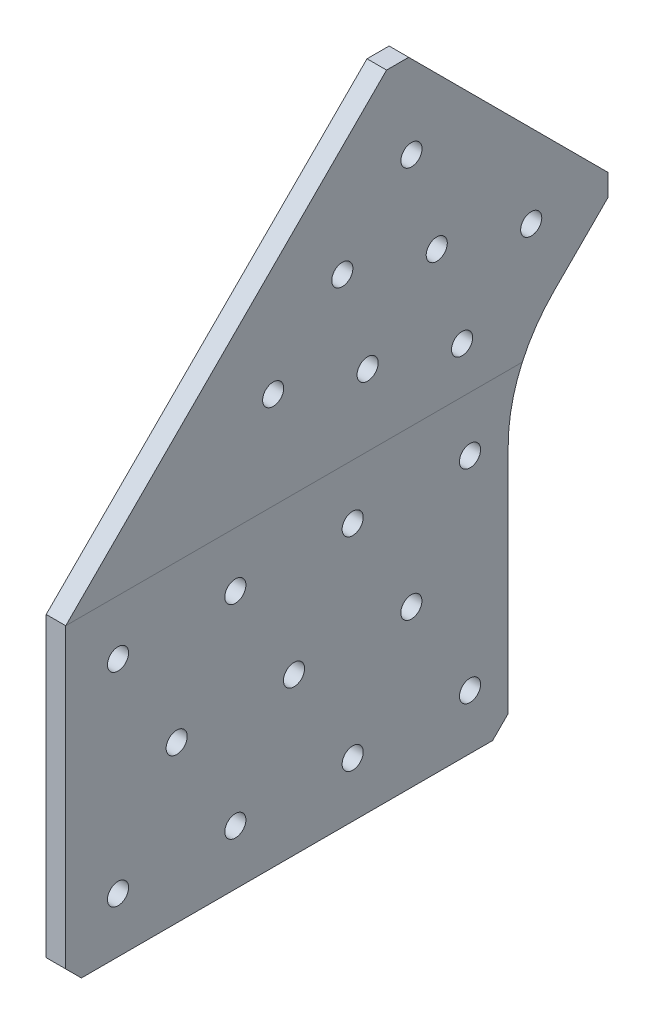
ISO-10303-21;
HEADER;
FILE_DESCRIPTION(('STEP AP214'),'2;1');
FILE_NAME('part.step','',(''),(''),'','','');
FILE_SCHEMA(('AUTOMOTIVE_DESIGN { 1 0 10303 214 1 1 1 1 }'));
ENDSEC;
DATA;
#1=APPLICATION_CONTEXT('core data for automotive mechanical design processes');
#2=APPLICATION_PROTOCOL_DEFINITION('international standard','automotive_design',2000,#1);
#3=PRODUCT_CONTEXT('',#1,'mechanical');
#4=PRODUCT('Part','Part','',(#3));
#5=PRODUCT_RELATED_PRODUCT_CATEGORY('part','',(#4));
#6=PRODUCT_DEFINITION_FORMATION('','',#4);
#7=PRODUCT_DEFINITION_CONTEXT('part definition',#1,'design');
#8=PRODUCT_DEFINITION('design','',#6,#7);
#9=PRODUCT_DEFINITION_SHAPE('','',#8);
#10=(LENGTH_UNIT() NAMED_UNIT(*) SI_UNIT(.MILLI.,.METRE.));
#11=(NAMED_UNIT(*) PLANE_ANGLE_UNIT() SI_UNIT($,.RADIAN.));
#12=(NAMED_UNIT(*) SI_UNIT($,.STERADIAN.) SOLID_ANGLE_UNIT());
#13=UNCERTAINTY_MEASURE_WITH_UNIT(LENGTH_MEASURE(1.E-05),#10,'distance_accuracy_value','');
#14=(GEOMETRIC_REPRESENTATION_CONTEXT(3) GLOBAL_UNCERTAINTY_ASSIGNED_CONTEXT((#13)) GLOBAL_UNIT_ASSIGNED_CONTEXT((#10,
#11,#12)) REPRESENTATION_CONTEXT('',''));
#15=CARTESIAN_POINT('',(0.,0.,0.));
#16=DIRECTION('',(0.,0.,1.));
#17=DIRECTION('',(1.,0.,0.));
#18=AXIS2_PLACEMENT_3D('',#15,#16,#17);
#19=CARTESIAN_POINT('',(3.175,40.2789755157233,-25.4));
#20=DIRECTION('',(1.,0.,0.));
#21=DIRECTION('',(0.,0.,-1.));
#22=AXIS2_PLACEMENT_3D('',#19,#20,#21);
#23=PLANE('',#22);
#24=CARTESIAN_POINT('',(3.175,41.8977839420936,6.20530694255749));
#25=DIRECTION('',(1.,0.,0.));
#26=DIRECTION('',(0.,1.,0.));
#27=AXIS2_PLACEMENT_3D('',#24,#25,#26);
#28=CIRCLE('',#27,1.7145);
#29=CARTESIAN_POINT('',(3.175,43.6122839420936,6.20530694255749));
#30=VERTEX_POINT('',#29);
#31=EDGE_CURVE('E404',#30,#30,#28,.T.);
#32=ORIENTED_EDGE('',*,*,#31,.F.);
#33=EDGE_LOOP('',(#32));
#34=FACE_BOUND('',#33,.T.);
#35=CARTESIAN_POINT('',(3.175,41.8977839420936,25.2553069425574));
#36=DIRECTION('',(1.,0.,0.));
#37=DIRECTION('',(0.,1.,0.));
#38=AXIS2_PLACEMENT_3D('',#35,#36,#37);
#39=CIRCLE('',#38,1.7145);
#40=CARTESIAN_POINT('',(3.175,43.6122839420936,25.2553069425574));
#41=VERTEX_POINT('',#40);
#42=EDGE_CURVE('E412',#41,#41,#39,.T.);
#43=ORIENTED_EDGE('',*,*,#42,.F.);
#44=EDGE_LOOP('',(#43));
#45=FACE_BOUND('',#44,.T.);
#46=CARTESIAN_POINT('',(3.175,41.8977839420936,44.3053069425573));
#47=DIRECTION('',(1.,0.,0.));
#48=DIRECTION('',(0.,1.,0.));
#49=AXIS2_PLACEMENT_3D('',#46,#47,#48);
#50=CIRCLE('',#49,1.7145);
#51=CARTESIAN_POINT('',(3.175,43.6122839420936,44.3053069425573));
#52=VERTEX_POINT('',#51);
#53=EDGE_CURVE('E420',#52,#52,#50,.T.);
#54=ORIENTED_EDGE('',*,*,#53,.F.);
#55=EDGE_LOOP('',(#54));
#56=FACE_BOUND('',#55,.T.);
#57=CARTESIAN_POINT('',(3.175,41.8977839420936,63.3553069425573));
#58=DIRECTION('',(1.,0.,0.));
#59=DIRECTION('',(0.,1.,0.));
#60=AXIS2_PLACEMENT_3D('',#57,#58,#59);
#61=CIRCLE('',#60,1.7145);
#62=CARTESIAN_POINT('',(3.175,43.6122839420936,63.3553069425573));
#63=VERTEX_POINT('',#62);
#64=EDGE_CURVE('E428',#63,#63,#61,.T.);
#65=ORIENTED_EDGE('',*,*,#64,.F.);
#66=EDGE_LOOP('',(#65));
#67=FACE_BOUND('',#66,.T.);
#68=CARTESIAN_POINT('',(3.175,8.90221605790642,25.2553069425574));
#69=DIRECTION('',(1.,0.,0.));
#70=DIRECTION('',(0.,1.,0.));
#71=AXIS2_PLACEMENT_3D('',#68,#69,#70);
#72=CIRCLE('',#71,1.7145);
#73=CARTESIAN_POINT('',(3.175,10.6167160579064,25.2553069425574));
#74=VERTEX_POINT('',#73);
#75=EDGE_CURVE('E385',#74,#74,#72,.T.);
#76=ORIENTED_EDGE('',*,*,#75,.F.);
#77=EDGE_LOOP('',(#76));
#78=FACE_BOUND('',#77,.T.);
#79=CARTESIAN_POINT('',(3.175,25.4,53.8303069425573));
#80=DIRECTION('',(1.,0.,0.));
#81=DIRECTION('',(0.,1.,0.));
#82=AXIS2_PLACEMENT_3D('',#79,#80,#81);
#83=CIRCLE('',#82,1.7145);
#84=CARTESIAN_POINT('',(3.175,27.1145,53.8303069425573));
#85=VERTEX_POINT('',#84);
#86=EDGE_CURVE('E438',#85,#85,#83,.T.);
#87=ORIENTED_EDGE('',*,*,#86,.F.);
#88=EDGE_LOOP('',(#87));
#89=FACE_BOUND('',#88,.T.);
#90=CARTESIAN_POINT('',(3.175,25.4,34.7803069425574));
#91=DIRECTION('',(1.,0.,0.));
#92=DIRECTION('',(0.,1.,0.));
#93=AXIS2_PLACEMENT_3D('',#90,#91,#92);
#94=CIRCLE('',#93,1.7145);
#95=CARTESIAN_POINT('',(3.175,27.1145,34.7803069425574));
#96=VERTEX_POINT('',#95);
#97=EDGE_CURVE('E437',#96,#96,#94,.T.);
#98=ORIENTED_EDGE('',*,*,#97,.F.);
#99=EDGE_LOOP('',(#98));
#100=FACE_BOUND('',#99,.T.);
#101=CARTESIAN_POINT('',(3.175,25.4,15.7303069425575));
#102=DIRECTION('',(1.,0.,0.));
#103=DIRECTION('',(0.,1.,0.));
#104=AXIS2_PLACEMENT_3D('',#101,#102,#103);
#105=CIRCLE('',#104,1.7145);
#106=CARTESIAN_POINT('',(3.175,27.1145,15.7303069425575));
#107=VERTEX_POINT('',#106);
#108=EDGE_CURVE('E452',#107,#107,#105,.T.);
#109=ORIENTED_EDGE('',*,*,#108,.F.);
#110=EDGE_LOOP('',(#109));
#111=FACE_BOUND('',#110,.T.);
#112=CARTESIAN_POINT('',(3.175,8.90221605790642,44.3053069425573));
#113=DIRECTION('',(1.,0.,0.));
#114=DIRECTION('',(0.,1.,0.));
#115=AXIS2_PLACEMENT_3D('',#112,#113,#114);
#116=CIRCLE('',#115,1.7145);
#117=CARTESIAN_POINT('',(3.175,10.6167160579064,44.3053069425573));
#118=VERTEX_POINT('',#117);
#119=EDGE_CURVE('E386',#118,#118,#116,.T.);
#120=ORIENTED_EDGE('',*,*,#119,.F.);
#121=EDGE_LOOP('',(#120));
#122=FACE_BOUND('',#121,.T.);
#123=CARTESIAN_POINT('',(3.175,8.90221605790642,63.3553069425573));
#124=DIRECTION('',(1.,0.,0.));
#125=DIRECTION('',(0.,1.,0.));
#126=AXIS2_PLACEMENT_3D('',#123,#124,#125);
#127=CIRCLE('',#126,1.7145);
#128=CARTESIAN_POINT('',(3.175,10.6167160579064,63.3553069425573));
#129=VERTEX_POINT('',#128);
#130=EDGE_CURVE('E394',#129,#129,#127,.T.);
#131=ORIENTED_EDGE('',*,*,#130,.F.);
#132=EDGE_LOOP('',(#131));
#133=FACE_BOUND('',#132,.T.);
#134=CARTESIAN_POINT('',(3.175,8.90221605790642,6.20530694255749));
#135=DIRECTION('',(1.,0.,0.));
#136=DIRECTION('',(0.,1.,0.));
#137=AXIS2_PLACEMENT_3D('',#134,#135,#136);
#138=CIRCLE('',#137,1.7145);
#139=CARTESIAN_POINT('',(3.175,10.6167160579064,6.20530694255749));
#140=VERTEX_POINT('',#139);
#141=EDGE_CURVE('E403',#140,#140,#138,.T.);
#142=ORIENTED_EDGE('',*,*,#141,.F.);
#143=EDGE_LOOP('',(#142));
#144=FACE_BOUND('',#143,.T.);
#145=DIRECTION('',(0.,-1.,0.));
#146=VECTOR('',#145,1.);
#147=CARTESIAN_POINT('',(3.175,50.8,71.8420489685536));
#148=LINE('',#147,#146);
#149=CARTESIAN_POINT('',(3.175,50.8,71.8420489685536));
#150=VERTEX_POINT('',#149);
#151=CARTESIAN_POINT('',(3.175,2.54,71.8420489685536));
#152=VERTEX_POINT('',#151);
#153=EDGE_CURVE('E189',#150,#152,#148,.T.);
#154=ORIENTED_EDGE('',*,*,#153,.T.);
#155=DIRECTION('',(0.,0.707106781186546,0.70710678118655));
#156=VECTOR('',#155,1.);
#157=CARTESIAN_POINT('',(3.175,-27.2115367264152,42.0905122421382));
#158=LINE('',#157,#156);
#159=CARTESIAN_POINT('',(3.175,0.,69.3020489685536));
#160=VERTEX_POINT('',#159);
#161=EDGE_CURVE('E249',#152,#160,#158,.F.);
#162=ORIENTED_EDGE('',*,*,#161,.T.);
#163=DIRECTION('',(0.,0.,-1.));
#164=VECTOR('',#163,1.);
#165=CARTESIAN_POINT('',(3.175,0.,71.8420489685536));
#166=LINE('',#165,#164);
#167=CARTESIAN_POINT('',(3.175,0.,2.54000000000001));
#168=VERTEX_POINT('',#167);
#169=EDGE_CURVE('E158',#160,#168,#166,.T.);
#170=ORIENTED_EDGE('',*,*,#169,.T.);
#171=DIRECTION('',(0.,-0.707106781186546,0.70710678118655));
#172=VECTOR('',#171,1.);
#173=CARTESIAN_POINT('',(3.175,34.1094877578615,-31.5694877578617));
#174=LINE('',#173,#172);
#175=CARTESIAN_POINT('',(3.175,2.54,0.));
#176=VERTEX_POINT('',#175);
#177=EDGE_CURVE('E152',#168,#176,#174,.F.);
#178=ORIENTED_EDGE('',*,*,#177,.T.);
#179=DIRECTION('',(0.,1.,0.));
#180=VECTOR('',#179,1.);
#181=CARTESIAN_POINT('',(3.175,0.,0.));
#182=LINE('',#181,#180);
#183=CARTESIAN_POINT('',(3.175,40.2789755157233,0.));
#184=VERTEX_POINT('',#183);
#185=EDGE_CURVE('E144',#176,#184,#182,.T.);
#186=ORIENTED_EDGE('',*,*,#185,.T.);
#187=CARTESIAN_POINT('',(3.175,40.2789755157233,-25.4));
#188=DIRECTION('',(-1.,0.,0.));
#189=DIRECTION('',(0.,0.,-1.));
#190=AXIS2_PLACEMENT_3D('',#187,#188,#189);
#191=CIRCLE('',#190,25.4);
#192=CARTESIAN_POINT('',(3.175,50.8,-2.28143508343888));
#193=VERTEX_POINT('',#192);
#194=EDGE_CURVE('E149',#184,#193,#191,.T.);
#195=ORIENTED_EDGE('',*,*,#194,.T.);
#196=DIRECTION('',(0.,0.,1.));
#197=VECTOR('',#196,1.);
#198=CARTESIAN_POINT('',(3.175,50.8,-25.4));
#199=LINE('',#198,#197);
#200=EDGE_CURVE('E168',#193,#150,#199,.T.);
#201=ORIENTED_EDGE('',*,*,#200,.T.);
#202=EDGE_LOOP('',(#154,#162,#170,#178,#186,#195,#201));
#203=FACE_BOUND('',#202,.T.);
#204=ADVANCED_FACE('F52',(#34,#45,#56,#67,#78,#89,#100,#111,#122,#133,#144,#203),#23,.T.);
#205=CARTESIAN_POINT('',(3.175,0.,71.8420489685536));
#206=DIRECTION('',(0.,1.,0.));
#207=DIRECTION('',(0.,0.,1.));
#208=AXIS2_PLACEMENT_3D('',#205,#206,#207);
#209=PLANE('',#208);
#210=ORIENTED_EDGE('',*,*,#169,.F.);
#211=DIRECTION('',(-1.,0.,0.));
#212=VECTOR('',#211,1.);
#213=CARTESIAN_POINT('',(3.175,0.,69.3020489685536));
#214=LINE('',#213,#212);
#215=CARTESIAN_POINT('',(0.,0.,69.3020489685536));
#216=VERTEX_POINT('',#215);
#217=EDGE_CURVE('E228',#160,#216,#214,.T.);
#218=ORIENTED_EDGE('',*,*,#217,.T.);
#219=DIRECTION('',(0.,0.,-1.));
#220=VECTOR('',#219,1.);
#221=CARTESIAN_POINT('',(0.,0.,71.8420489685536));
#222=LINE('',#221,#220);
#223=CARTESIAN_POINT('',(0.,0.,2.54000000000001));
#224=VERTEX_POINT('',#223);
#225=EDGE_CURVE('E193',#216,#224,#222,.T.);
#226=ORIENTED_EDGE('',*,*,#225,.T.);
#227=DIRECTION('',(1.,0.,0.));
#228=VECTOR('',#227,1.);
#229=CARTESIAN_POINT('',(3.175,0.,2.54000000000001));
#230=LINE('',#229,#228);
#231=EDGE_CURVE('E225',#224,#168,#230,.T.);
#232=ORIENTED_EDGE('',*,*,#231,.T.);
#233=EDGE_LOOP('',(#210,#218,#226,#232));
#234=FACE_BOUND('',#233,.T.);
#235=ADVANCED_FACE('F287',(#234),#209,.F.);
#236=CARTESIAN_POINT('',(3.175,0.,0.));
#237=DIRECTION('',(0.,0.,1.));
#238=DIRECTION('',(1.,0.,0.));
#239=AXIS2_PLACEMENT_3D('',#236,#237,#238);
#240=PLANE('',#239);
#241=ORIENTED_EDGE('',*,*,#185,.F.);
#242=DIRECTION('',(-1.,0.,0.));
#243=VECTOR('',#242,1.);
#244=CARTESIAN_POINT('',(3.175,2.54,0.));
#245=LINE('',#244,#243);
#246=CARTESIAN_POINT('',(0.,2.54,0.));
#247=VERTEX_POINT('',#246);
#248=EDGE_CURVE('E252',#176,#247,#245,.T.);
#249=ORIENTED_EDGE('',*,*,#248,.T.);
#250=DIRECTION('',(0.,1.,0.));
#251=VECTOR('',#250,1.);
#252=CARTESIAN_POINT('',(0.,0.,0.));
#253=LINE('',#252,#251);
#254=CARTESIAN_POINT('',(0.,40.2789755157233,0.));
#255=VERTEX_POINT('',#254);
#256=EDGE_CURVE('E164',#247,#255,#253,.T.);
#257=ORIENTED_EDGE('',*,*,#256,.T.);
#258=DIRECTION('',(-1.,0.,0.));
#259=VECTOR('',#258,1.);
#260=CARTESIAN_POINT('',(3.175,40.2789755157233,0.));
#261=LINE('',#260,#259);
#262=EDGE_CURVE('E161',#184,#255,#261,.T.);
#263=ORIENTED_EDGE('',*,*,#262,.F.);
#264=EDGE_LOOP('',(#241,#249,#257,#263));
#265=FACE_BOUND('',#264,.T.);
#266=ADVANCED_FACE('F162',(#265),#240,.F.);
#267=CARTESIAN_POINT('',(3.175,40.2789755157233,-25.4));
#268=DIRECTION('',(-1.,0.,0.));
#269=DIRECTION('',(0.,0.,1.));
#270=AXIS2_PLACEMENT_3D('',#267,#268,#269);
#271=CYLINDRICAL_SURFACE('',#270,25.4);
#272=CARTESIAN_POINT('',(0.,40.2789755157233,-25.4));
#273=DIRECTION('',(-1.,0.,0.));
#274=DIRECTION('',(0.,0.,-1.));
#275=AXIS2_PLACEMENT_3D('',#272,#273,#274);
#276=CIRCLE('',#275,25.4);
#277=CARTESIAN_POINT('',(0.,58.2394877578617,-7.43948775786178));
#278=VERTEX_POINT('',#277);
#279=EDGE_CURVE('E200',#255,#278,#276,.T.);
#280=ORIENTED_EDGE('',*,*,#279,.T.);
#281=DIRECTION('',(-1.,0.,0.));
#282=VECTOR('',#281,1.);
#283=CARTESIAN_POINT('',(3.175,58.2394877578617,-7.43948775786178));
#284=LINE('',#283,#282);
#285=CARTESIAN_POINT('',(3.175,58.2394877578617,-7.43948775786178));
#286=VERTEX_POINT('',#285);
#287=EDGE_CURVE('E169',#286,#278,#284,.T.);
#288=ORIENTED_EDGE('',*,*,#287,.F.);
#289=EDGE_CURVE('E157',#193,#286,#191,.T.);
#290=ORIENTED_EDGE('',*,*,#289,.F.);
#291=ORIENTED_EDGE('',*,*,#194,.F.);
#292=ORIENTED_EDGE('',*,*,#262,.T.);
#293=EDGE_LOOP('',(#280,#288,#290,#291,#292));
#294=FACE_BOUND('',#293,.T.);
#295=ADVANCED_FACE('F172',(#294),#271,.F.);
#296=CARTESIAN_POINT('',(3.175,58.2394877578617,-7.43948775786178));
#297=DIRECTION('',(0.,0.707106781186551,0.707106781186544));
#298=DIRECTION('',(0.,-0.707106781186544,0.707106781186551));
#299=AXIS2_PLACEMENT_3D('',#296,#297,#298);
#300=PLANE('',#299);
#301=DIRECTION('',(0.,0.707106781186544,-0.707106781186551));
#302=VECTOR('',#301,1.);
#303=CARTESIAN_POINT('',(0.,58.2394877578617,-7.43948775786178));
#304=LINE('',#303,#302);
#305=CARTESIAN_POINT('',(0.,66.9644610179244,-16.1644610179245));
#306=VERTEX_POINT('',#305);
#307=EDGE_CURVE('E203',#278,#306,#304,.T.);
#308=ORIENTED_EDGE('',*,*,#307,.T.);
#309=DIRECTION('',(1.,0.,0.));
#310=VECTOR('',#309,1.);
#311=CARTESIAN_POINT('',(3.175,66.9644610179244,-16.1644610179245));
#312=LINE('',#311,#310);
#313=CARTESIAN_POINT('',(3.175,66.9644610179244,-16.1644610179245));
#314=VERTEX_POINT('',#313);
#315=EDGE_CURVE('E77',#306,#314,#312,.T.);
#316=ORIENTED_EDGE('',*,*,#315,.T.);
#317=DIRECTION('',(0.,0.707106781186544,-0.707106781186551));
#318=VECTOR('',#317,1.);
#319=CARTESIAN_POINT('',(3.175,58.2394877578617,-7.43948775786178));
#320=LINE('',#319,#318);
#321=EDGE_CURVE('E175',#286,#314,#320,.T.);
#322=ORIENTED_EDGE('',*,*,#321,.F.);
#323=ORIENTED_EDGE('',*,*,#287,.T.);
#324=EDGE_LOOP('',(#308,#316,#322,#323));
#325=FACE_BOUND('',#324,.T.);
#326=ADVANCED_FACE('F282',(#325),#300,.F.);
#327=CARTESIAN_POINT('',(3.175,104.681536726415,17.960512242138));
#328=DIRECTION('',(0.,-0.707106781186544,0.707106781186551));
#329=DIRECTION('',(0.,-0.707106781186551,-0.707106781186544));
#330=AXIS2_PLACEMENT_3D('',#327,#328,#329);
#331=PLANE('',#330);
#332=DIRECTION('',(0.,0.707106781186551,0.707106781186544));
#333=VECTOR('',#332,1.);
#334=CARTESIAN_POINT('',(3.175,104.681536726415,17.960512242138));
#335=LINE('',#334,#333);
#336=CARTESIAN_POINT('',(3.175,70.5565634663521,-16.1644610179246));
#337=VERTEX_POINT('',#336);
#338=CARTESIAN_POINT('',(3.175,102.885485502201,16.1644610179242));
#339=VERTEX_POINT('',#338);
#340=EDGE_CURVE('E180',#337,#339,#335,.T.);
#341=ORIENTED_EDGE('',*,*,#340,.F.);
#342=DIRECTION('',(-1.,0.,0.));
#343=VECTOR('',#342,1.);
#344=CARTESIAN_POINT('',(3.175,70.5565634663521,-16.1644610179245));
#345=LINE('',#344,#343);
#346=CARTESIAN_POINT('',(0.,70.5565634663521,-16.1644610179246));
#347=VERTEX_POINT('',#346);
#348=EDGE_CURVE('E258',#337,#347,#345,.T.);
#349=ORIENTED_EDGE('',*,*,#348,.T.);
#350=DIRECTION('',(0.,0.707106781186551,0.707106781186544));
#351=VECTOR('',#350,1.);
#352=CARTESIAN_POINT('',(0.,104.681536726415,17.960512242138));
#353=LINE('',#352,#351);
#354=CARTESIAN_POINT('',(0.,102.885485502201,16.1644610179242));
#355=VERTEX_POINT('',#354);
#356=EDGE_CURVE('E206',#347,#355,#353,.T.);
#357=ORIENTED_EDGE('',*,*,#356,.T.);
#358=DIRECTION('',(1.,0.,0.));
#359=VECTOR('',#358,1.);
#360=CARTESIAN_POINT('',(3.175,102.885485502201,16.1644610179242));
#361=LINE('',#360,#359);
#362=EDGE_CURVE('E255',#355,#339,#361,.T.);
#363=ORIENTED_EDGE('',*,*,#362,.T.);
#364=EDGE_LOOP('',(#341,#349,#357,#363));
#365=FACE_BOUND('',#364,.T.);
#366=ADVANCED_FACE('F274',(#365),#331,.F.);
#367=CARTESIAN_POINT('',(3.175,104.681536726415,17.960512242138));
#368=DIRECTION('',(0.,-0.707106781186551,-0.707106781186544));
#369=DIRECTION('',(0.,0.707106781186544,-0.707106781186551));
#370=AXIS2_PLACEMENT_3D('',#367,#368,#369);
#371=PLANE('',#370);
#372=DIRECTION('',(0.,-0.707106781186544,0.707106781186551));
#373=VECTOR('',#372,1.);
#374=CARTESIAN_POINT('',(3.175,104.681536726415,17.960512242138));
#375=LINE('',#374,#373);
#376=CARTESIAN_POINT('',(3.175,102.885485502201,19.7565634663519));
#377=VERTEX_POINT('',#376);
#378=EDGE_CURVE('E186',#377,#150,#375,.T.);
#379=ORIENTED_EDGE('',*,*,#378,.F.);
#380=DIRECTION('',(-1.,0.,0.));
#381=VECTOR('',#380,1.);
#382=CARTESIAN_POINT('',(3.175,102.885485502201,19.7565634663519));
#383=LINE('',#382,#381);
#384=CARTESIAN_POINT('',(0.,102.885485502201,19.7565634663519));
#385=VERTEX_POINT('',#384);
#386=EDGE_CURVE('E12',#377,#385,#383,.T.);
#387=ORIENTED_EDGE('',*,*,#386,.T.);
#388=DIRECTION('',(0.,-0.707106781186544,0.707106781186551));
#389=VECTOR('',#388,1.);
#390=CARTESIAN_POINT('',(0.,104.681536726415,17.960512242138));
#391=LINE('',#390,#389);
#392=CARTESIAN_POINT('',(0.,50.8,71.8420489685536));
#393=VERTEX_POINT('',#392);
#394=EDGE_CURVE('E210',#385,#393,#391,.T.);
#395=ORIENTED_EDGE('',*,*,#394,.T.);
#396=DIRECTION('',(-1.,0.,0.));
#397=VECTOR('',#396,1.);
#398=CARTESIAN_POINT('',(3.175,50.8,71.8420489685536));
#399=LINE('',#398,#397);
#400=EDGE_CURVE('E192',#150,#393,#399,.T.);
#401=ORIENTED_EDGE('',*,*,#400,.F.);
#402=EDGE_LOOP('',(#379,#387,#395,#401));
#403=FACE_BOUND('',#402,.T.);
#404=ADVANCED_FACE('F321',(#403),#371,.F.);
#405=CARTESIAN_POINT('',(3.175,50.8,71.8420489685536));
#406=DIRECTION('',(0.,0.,-1.));
#407=DIRECTION('',(0.,1.,0.));
#408=AXIS2_PLACEMENT_3D('',#405,#406,#407);
#409=PLANE('',#408);
#410=DIRECTION('',(0.,-1.,0.));
#411=VECTOR('',#410,1.);
#412=CARTESIAN_POINT('',(0.,50.8,71.8420489685536));
#413=LINE('',#412,#411);
#414=CARTESIAN_POINT('',(0.,2.54,71.8420489685536));
#415=VERTEX_POINT('',#414);
#416=EDGE_CURVE('E213',#393,#415,#413,.T.);
#417=ORIENTED_EDGE('',*,*,#416,.T.);
#418=DIRECTION('',(1.,0.,0.));
#419=VECTOR('',#418,1.);
#420=CARTESIAN_POINT('',(3.175,2.54,71.8420489685536));
#421=LINE('',#420,#419);
#422=EDGE_CURVE('E244',#415,#152,#421,.T.);
#423=ORIENTED_EDGE('',*,*,#422,.T.);
#424=ORIENTED_EDGE('',*,*,#153,.F.);
#425=ORIENTED_EDGE('',*,*,#400,.T.);
#426=EDGE_LOOP('',(#417,#423,#424,#425));
#427=FACE_BOUND('',#426,.T.);
#428=ADVANCED_FACE('F313',(#427),#409,.F.);
#429=CARTESIAN_POINT('',(3.175,66.5154482118712,38.1660885145441));
#430=DIRECTION('',(1.,0.,0.));
#431=DIRECTION('',(0.,1.,0.));
#432=AXIS2_PLACEMENT_3D('',#429,#430,#431);
#433=CIRCLE('',#432,1.7145);
#434=CARTESIAN_POINT('',(3.175,68.2299482118712,38.1660885145441));
#435=VERTEX_POINT('',#434);
#436=EDGE_CURVE('E327',#435,#435,#433,.T.);
#437=ORIENTED_EDGE('',*,*,#436,.F.);
#438=EDGE_LOOP('',(#437));
#439=FACE_BOUND('',#438,.T.);
#440=CARTESIAN_POINT('',(3.175,88.9660885145439,15.7154482118712));
#441=DIRECTION('',(1.,0.,0.));
#442=DIRECTION('',(0.,1.,0.));
#443=AXIS2_PLACEMENT_3D('',#440,#441,#442);
#444=CIRCLE('',#443,1.7145);
#445=CARTESIAN_POINT('',(3.175,90.6805885145438,15.7154482118712));
#446=VERTEX_POINT('',#445);
#447=EDGE_CURVE('E331',#446,#446,#444,.T.);
#448=ORIENTED_EDGE('',*,*,#447,.F.);
#449=EDGE_LOOP('',(#448));
#450=FACE_BOUND('',#449,.T.);
#451=CARTESIAN_POINT('',(3.175,73.6320160222049,11.6066958708687));
#452=DIRECTION('',(1.,0.,0.));
#453=DIRECTION('',(0.,1.,0.));
#454=AXIS2_PLACEMENT_3D('',#451,#452,#453);
#455=CIRCLE('',#454,1.7145);
#456=CARTESIAN_POINT('',(3.175,75.3465160222049,11.6066958708687));
#457=VERTEX_POINT('',#456);
#458=EDGE_CURVE('E335',#457,#457,#455,.T.);
#459=ORIENTED_EDGE('',*,*,#458,.F.);
#460=EDGE_LOOP('',(#459));
#461=FACE_BOUND('',#460,.T.);
#462=CARTESIAN_POINT('',(3.175,77.7407683632075,26.9407683632076));
#463=DIRECTION('',(1.,0.,0.));
#464=DIRECTION('',(0.,1.,0.));
#465=AXIS2_PLACEMENT_3D('',#462,#463,#464);
#466=CIRCLE('',#465,1.7145);
#467=CARTESIAN_POINT('',(3.175,79.4552683632075,26.9407683632076));
#468=VERTEX_POINT('',#467);
#469=EDGE_CURVE('E339',#468,#468,#466,.T.);
#470=ORIENTED_EDGE('',*,*,#469,.F.);
#471=EDGE_LOOP('',(#470));
#472=FACE_BOUND('',#471,.T.);
#473=CARTESIAN_POINT('',(3.175,69.5232636812023,-3.72737662147023));
#474=DIRECTION('',(1.,0.,0.));
#475=DIRECTION('',(0.,1.,0.));
#476=AXIS2_PLACEMENT_3D('',#473,#474,#475);
#477=CIRCLE('',#476,1.7145);
#478=CARTESIAN_POINT('',(3.175,71.2377636812022,-3.72737662147023));
#479=VERTEX_POINT('',#478);
#480=EDGE_CURVE('E343',#479,#479,#477,.T.);
#481=ORIENTED_EDGE('',*,*,#480,.F.);
#482=EDGE_LOOP('',(#481));
#483=FACE_BOUND('',#482,.T.);
#484=CARTESIAN_POINT('',(3.175,58.2979435298659,7.49794352986623));
#485=DIRECTION('',(1.,0.,0.));
#486=DIRECTION('',(0.,1.,0.));
#487=AXIS2_PLACEMENT_3D('',#484,#485,#486);
#488=CIRCLE('',#487,1.7145);
#489=CARTESIAN_POINT('',(3.175,60.0124435298659,7.49794352986623));
#490=VERTEX_POINT('',#489);
#491=EDGE_CURVE('E347',#490,#490,#488,.T.);
#492=ORIENTED_EDGE('',*,*,#491,.F.);
#493=EDGE_LOOP('',(#492));
#494=FACE_BOUND('',#493,.T.);
#495=CARTESIAN_POINT('',(3.175,62.4066958708685,22.8320160222052));
#496=DIRECTION('',(1.,0.,0.));
#497=DIRECTION('',(0.,1.,0.));
#498=AXIS2_PLACEMENT_3D('',#495,#496,#497);
#499=CIRCLE('',#498,1.7145);
#500=CARTESIAN_POINT('',(3.175,64.1211958708685,22.8320160222052));
#501=VERTEX_POINT('',#500);
#502=EDGE_CURVE('E350',#501,#501,#499,.T.);
#503=ORIENTED_EDGE('',*,*,#502,.F.);
#504=EDGE_LOOP('',(#503));
#505=FACE_BOUND('',#504,.T.);
#506=ORIENTED_EDGE('',*,*,#321,.T.);
#507=DIRECTION('',(0.,-1.,0.));
#508=VECTOR('',#507,1.);
#509=CARTESIAN_POINT('',(3.175,40.2789755157233,-16.1644610179244));
#510=LINE('',#509,#508);
#511=EDGE_CURVE('E62',#314,#337,#510,.F.);
#512=ORIENTED_EDGE('',*,*,#511,.T.);
#513=ORIENTED_EDGE('',*,*,#340,.T.);
#514=DIRECTION('',(0.,0.,-1.));
#515=VECTOR('',#514,1.);
#516=CARTESIAN_POINT('',(3.175,102.885485502201,-25.4000000000002));
#517=LINE('',#516,#515);
#518=EDGE_CURVE('E69',#339,#377,#517,.F.);
#519=ORIENTED_EDGE('',*,*,#518,.T.);
#520=ORIENTED_EDGE('',*,*,#378,.T.);
#521=ORIENTED_EDGE('',*,*,#200,.F.);
#522=ORIENTED_EDGE('',*,*,#289,.T.);
#523=EDGE_LOOP('',(#506,#512,#513,#519,#520,#521,#522));
#524=FACE_BOUND('',#523,.T.);
#525=ADVANCED_FACE('F270',(#439,#450,#461,#472,#483,#494,#505,#524),#23,.T.);
#526=CARTESIAN_POINT('',(0.,40.2789755157233,-25.4));
#527=DIRECTION('',(1.,0.,0.));
#528=DIRECTION('',(0.,0.,-1.));
#529=AXIS2_PLACEMENT_3D('',#526,#527,#528);
#530=PLANE('',#529);
#531=CARTESIAN_POINT('',(0.,66.5154482118712,38.1660885145441));
#532=DIRECTION('',(1.,0.,0.));
#533=DIRECTION('',(0.,1.,0.));
#534=AXIS2_PLACEMENT_3D('',#531,#532,#533);
#535=CIRCLE('',#534,1.7145);
#536=CARTESIAN_POINT('',(0.,68.2299482118712,38.1660885145441));
#537=VERTEX_POINT('',#536);
#538=EDGE_CURVE('E398',#537,#537,#535,.T.);
#539=ORIENTED_EDGE('',*,*,#538,.T.);
#540=EDGE_LOOP('',(#539));
#541=FACE_BOUND('',#540,.T.);
#542=CARTESIAN_POINT('',(0.,88.9660885145439,15.7154482118712));
#543=DIRECTION('',(1.,0.,0.));
#544=DIRECTION('',(0.,1.,0.));
#545=AXIS2_PLACEMENT_3D('',#542,#543,#544);
#546=CIRCLE('',#545,1.7145);
#547=CARTESIAN_POINT('',(0.,90.6805885145438,15.7154482118712));
#548=VERTEX_POINT('',#547);
#549=EDGE_CURVE('E894',#548,#548,#546,.T.);
#550=ORIENTED_EDGE('',*,*,#549,.T.);
#551=EDGE_LOOP('',(#550));
#552=FACE_BOUND('',#551,.T.);
#553=CARTESIAN_POINT('',(0.,73.6320160222049,11.6066958708687));
#554=DIRECTION('',(1.,0.,0.));
#555=DIRECTION('',(0.,1.,0.));
#556=AXIS2_PLACEMENT_3D('',#553,#554,#555);
#557=CIRCLE('',#556,1.7145);
#558=CARTESIAN_POINT('',(0.,75.3465160222049,11.6066958708687));
#559=VERTEX_POINT('',#558);
#560=EDGE_CURVE('E380',#559,#559,#557,.T.);
#561=ORIENTED_EDGE('',*,*,#560,.T.);
#562=EDGE_LOOP('',(#561));
#563=FACE_BOUND('',#562,.T.);
#564=CARTESIAN_POINT('',(0.,77.7407683632075,26.9407683632076));
#565=DIRECTION('',(1.,0.,0.));
#566=DIRECTION('',(0.,1.,0.));
#567=AXIS2_PLACEMENT_3D('',#564,#565,#566);
#568=CIRCLE('',#567,1.7145);
#569=CARTESIAN_POINT('',(0.,79.4552683632075,26.9407683632076));
#570=VERTEX_POINT('',#569);
#571=EDGE_CURVE('E374',#570,#570,#568,.T.);
#572=ORIENTED_EDGE('',*,*,#571,.T.);
#573=EDGE_LOOP('',(#572));
#574=FACE_BOUND('',#573,.T.);
#575=CARTESIAN_POINT('',(0.,69.5232636812023,-3.72737662147023));
#576=DIRECTION('',(1.,0.,0.));
#577=DIRECTION('',(0.,1.,0.));
#578=AXIS2_PLACEMENT_3D('',#575,#576,#577);
#579=CIRCLE('',#578,1.7145);
#580=CARTESIAN_POINT('',(0.,71.2377636812022,-3.72737662147023));
#581=VERTEX_POINT('',#580);
#582=EDGE_CURVE('E368',#581,#581,#579,.T.);
#583=ORIENTED_EDGE('',*,*,#582,.T.);
#584=EDGE_LOOP('',(#583));
#585=FACE_BOUND('',#584,.T.);
#586=CARTESIAN_POINT('',(0.,58.2979435298659,7.49794352986623));
#587=DIRECTION('',(1.,0.,0.));
#588=DIRECTION('',(0.,1.,0.));
#589=AXIS2_PLACEMENT_3D('',#586,#587,#588);
#590=CIRCLE('',#589,1.7145);
#591=CARTESIAN_POINT('',(0.,60.0124435298659,7.49794352986623));
#592=VERTEX_POINT('',#591);
#593=EDGE_CURVE('E354',#592,#592,#590,.T.);
#594=ORIENTED_EDGE('',*,*,#593,.T.);
#595=EDGE_LOOP('',(#594));
#596=FACE_BOUND('',#595,.T.);
#597=CARTESIAN_POINT('',(0.,62.4066958708685,22.8320160222052));
#598=DIRECTION('',(1.,0.,0.));
#599=DIRECTION('',(0.,1.,0.));
#600=AXIS2_PLACEMENT_3D('',#597,#598,#599);
#601=CIRCLE('',#600,1.7145);
#602=CARTESIAN_POINT('',(0.,64.1211958708685,22.8320160222052));
#603=VERTEX_POINT('',#602);
#604=EDGE_CURVE('E353',#603,#603,#601,.T.);
#605=ORIENTED_EDGE('',*,*,#604,.T.);
#606=EDGE_LOOP('',(#605));
#607=FACE_BOUND('',#606,.T.);
#608=CARTESIAN_POINT('',(0.,41.8977839420936,6.20530694255749));
#609=DIRECTION('',(1.,0.,0.));
#610=DIRECTION('',(0.,1.,0.));
#611=AXIS2_PLACEMENT_3D('',#608,#609,#610);
#612=CIRCLE('',#611,1.7145);
#613=CARTESIAN_POINT('',(0.,43.6122839420936,6.20530694255749));
#614=VERTEX_POINT('',#613);
#615=EDGE_CURVE('E399',#614,#614,#612,.T.);
#616=ORIENTED_EDGE('',*,*,#615,.T.);
#617=EDGE_LOOP('',(#616));
#618=FACE_BOUND('',#617,.T.);
#619=CARTESIAN_POINT('',(0.,41.8977839420936,25.2553069425574));
#620=DIRECTION('',(1.,0.,0.));
#621=DIRECTION('',(0.,1.,0.));
#622=AXIS2_PLACEMENT_3D('',#619,#620,#621);
#623=CIRCLE('',#622,1.7145);
#624=CARTESIAN_POINT('',(0.,43.6122839420936,25.2553069425574));
#625=VERTEX_POINT('',#624);
#626=EDGE_CURVE('E408',#625,#625,#623,.T.);
#627=ORIENTED_EDGE('',*,*,#626,.T.);
#628=EDGE_LOOP('',(#627));
#629=FACE_BOUND('',#628,.T.);
#630=CARTESIAN_POINT('',(0.,41.8977839420936,44.3053069425573));
#631=DIRECTION('',(1.,0.,0.));
#632=DIRECTION('',(0.,1.,0.));
#633=AXIS2_PLACEMENT_3D('',#630,#631,#632);
#634=CIRCLE('',#633,1.7145);
#635=CARTESIAN_POINT('',(0.,43.6122839420936,44.3053069425573));
#636=VERTEX_POINT('',#635);
#637=EDGE_CURVE('E416',#636,#636,#634,.T.);
#638=ORIENTED_EDGE('',*,*,#637,.T.);
#639=EDGE_LOOP('',(#638));
#640=FACE_BOUND('',#639,.T.);
#641=CARTESIAN_POINT('',(0.,41.8977839420936,63.3553069425573));
#642=DIRECTION('',(1.,0.,0.));
#643=DIRECTION('',(0.,1.,0.));
#644=AXIS2_PLACEMENT_3D('',#641,#642,#643);
#645=CIRCLE('',#644,1.7145);
#646=CARTESIAN_POINT('',(0.,43.6122839420936,63.3553069425573));
#647=VERTEX_POINT('',#646);
#648=EDGE_CURVE('E424',#647,#647,#645,.T.);
#649=ORIENTED_EDGE('',*,*,#648,.T.);
#650=EDGE_LOOP('',(#649));
#651=FACE_BOUND('',#650,.T.);
#652=CARTESIAN_POINT('',(0.,8.90221605790642,25.2553069425574));
#653=DIRECTION('',(1.,0.,0.));
#654=DIRECTION('',(0.,1.,0.));
#655=AXIS2_PLACEMENT_3D('',#652,#653,#654);
#656=CIRCLE('',#655,1.7145);
#657=CARTESIAN_POINT('',(0.,10.6167160579064,25.2553069425574));
#658=VERTEX_POINT('',#657);
#659=EDGE_CURVE('E442',#658,#658,#656,.T.);
#660=ORIENTED_EDGE('',*,*,#659,.T.);
#661=EDGE_LOOP('',(#660));
#662=FACE_BOUND('',#661,.T.);
#663=CARTESIAN_POINT('',(0.,25.4,53.8303069425573));
#664=DIRECTION('',(1.,0.,0.));
#665=DIRECTION('',(0.,1.,0.));
#666=AXIS2_PLACEMENT_3D('',#663,#664,#665);
#667=CIRCLE('',#666,1.7145);
#668=CARTESIAN_POINT('',(0.,27.1145,53.8303069425573));
#669=VERTEX_POINT('',#668);
#670=EDGE_CURVE('E433',#669,#669,#667,.T.);
#671=ORIENTED_EDGE('',*,*,#670,.T.);
#672=EDGE_LOOP('',(#671));
#673=FACE_BOUND('',#672,.T.);
#674=CARTESIAN_POINT('',(0.,25.4,34.7803069425574));
#675=DIRECTION('',(1.,0.,0.));
#676=DIRECTION('',(0.,1.,0.));
#677=AXIS2_PLACEMENT_3D('',#674,#675,#676);
#678=CIRCLE('',#677,1.7145);
#679=CARTESIAN_POINT('',(0.,27.1145,34.7803069425574));
#680=VERTEX_POINT('',#679);
#681=EDGE_CURVE('E456',#680,#680,#678,.T.);
#682=ORIENTED_EDGE('',*,*,#681,.T.);
#683=EDGE_LOOP('',(#682));
#684=FACE_BOUND('',#683,.T.);
#685=CARTESIAN_POINT('',(0.,25.4,15.7303069425575));
#686=DIRECTION('',(1.,0.,0.));
#687=DIRECTION('',(0.,1.,0.));
#688=AXIS2_PLACEMENT_3D('',#685,#686,#687);
#689=CIRCLE('',#688,1.7145);
#690=CARTESIAN_POINT('',(0.,27.1145,15.7303069425575));
#691=VERTEX_POINT('',#690);
#692=EDGE_CURVE('E432',#691,#691,#689,.T.);
#693=ORIENTED_EDGE('',*,*,#692,.T.);
#694=EDGE_LOOP('',(#693));
#695=FACE_BOUND('',#694,.T.);
#696=CARTESIAN_POINT('',(0.,8.90221605790642,44.3053069425573));
#697=DIRECTION('',(1.,0.,0.));
#698=DIRECTION('',(0.,1.,0.));
#699=AXIS2_PLACEMENT_3D('',#696,#697,#698);
#700=CIRCLE('',#699,1.7145);
#701=CARTESIAN_POINT('',(0.,10.6167160579064,44.3053069425573));
#702=VERTEX_POINT('',#701);
#703=EDGE_CURVE('E381',#702,#702,#700,.T.);
#704=ORIENTED_EDGE('',*,*,#703,.T.);
#705=EDGE_LOOP('',(#704));
#706=FACE_BOUND('',#705,.T.);
#707=CARTESIAN_POINT('',(0.,8.90221605790642,63.3553069425573));
#708=DIRECTION('',(1.,0.,0.));
#709=DIRECTION('',(0.,1.,0.));
#710=AXIS2_PLACEMENT_3D('',#707,#708,#709);
#711=CIRCLE('',#710,1.7145);
#712=CARTESIAN_POINT('',(0.,10.6167160579064,63.3553069425573));
#713=VERTEX_POINT('',#712);
#714=EDGE_CURVE('E390',#713,#713,#711,.T.);
#715=ORIENTED_EDGE('',*,*,#714,.T.);
#716=EDGE_LOOP('',(#715));
#717=FACE_BOUND('',#716,.T.);
#718=CARTESIAN_POINT('',(0.,8.90221605790642,6.20530694255749));
#719=DIRECTION('',(1.,0.,0.));
#720=DIRECTION('',(0.,1.,0.));
#721=AXIS2_PLACEMENT_3D('',#718,#719,#720);
#722=CIRCLE('',#721,1.7145);
#723=CARTESIAN_POINT('',(0.,10.6167160579064,6.20530694255749));
#724=VERTEX_POINT('',#723);
#725=EDGE_CURVE('E197',#724,#724,#722,.T.);
#726=ORIENTED_EDGE('',*,*,#725,.T.);
#727=EDGE_LOOP('',(#726));
#728=FACE_BOUND('',#727,.T.);
#729=ORIENTED_EDGE('',*,*,#225,.F.);
#730=DIRECTION('',(0.,-0.707106781186546,-0.70710678118655));
#731=VECTOR('',#730,1.);
#732=CARTESIAN_POINT('',(0.,0.,69.3020489685536));
#733=LINE('',#732,#731);
#734=EDGE_CURVE('E241',#216,#415,#733,.F.);
#735=ORIENTED_EDGE('',*,*,#734,.T.);
#736=ORIENTED_EDGE('',*,*,#416,.F.);
#737=ORIENTED_EDGE('',*,*,#394,.F.);
#738=DIRECTION('',(0.,0.,1.));
#739=VECTOR('',#738,1.);
#740=CARTESIAN_POINT('',(0.,102.885485502201,19.7565634663519));
#741=LINE('',#740,#739);
#742=EDGE_CURVE('E232',#385,#355,#741,.F.);
#743=ORIENTED_EDGE('',*,*,#742,.T.);
#744=ORIENTED_EDGE('',*,*,#356,.F.);
#745=DIRECTION('',(0.,1.,0.));
#746=VECTOR('',#745,1.);
#747=CARTESIAN_POINT('',(0.,70.5565634663521,-16.1644610179246));
#748=LINE('',#747,#746);
#749=EDGE_CURVE('E235',#347,#306,#748,.F.);
#750=ORIENTED_EDGE('',*,*,#749,.T.);
#751=ORIENTED_EDGE('',*,*,#307,.F.);
#752=ORIENTED_EDGE('',*,*,#279,.F.);
#753=ORIENTED_EDGE('',*,*,#256,.F.);
#754=DIRECTION('',(0.,0.707106781186546,-0.70710678118655));
#755=VECTOR('',#754,1.);
#756=CARTESIAN_POINT('',(0.,2.54,0.));
#757=LINE('',#756,#755);
#758=EDGE_CURVE('E238',#247,#224,#757,.F.);
#759=ORIENTED_EDGE('',*,*,#758,.T.);
#760=EDGE_LOOP('',(#729,#735,#736,#737,#743,#744,#750,#751,#752,#753,#759));
#761=FACE_BOUND('',#760,.T.);
#762=ADVANCED_FACE('F281',(#541,#552,#563,#574,#585,#596,#607,#618,#629,#640,#651,#662,#673,
#684,#695,#706,#717,#728,#761),#530,.F.);
#763=CARTESIAN_POINT('',(0.,8.90221605790642,6.20530694255749));
#764=DIRECTION('',(1.,0.,0.));
#765=DIRECTION('',(0.,0.,-1.));
#766=AXIS2_PLACEMENT_3D('',#763,#764,#765);
#767=CYLINDRICAL_SURFACE('',#766,1.7145);
#768=ORIENTED_EDGE('',*,*,#725,.F.);
#769=EDGE_LOOP('',(#768));
#770=FACE_BOUND('',#769,.T.);
#771=ORIENTED_EDGE('',*,*,#141,.T.);
#772=EDGE_LOOP('',(#771));
#773=FACE_BOUND('',#772,.T.);
#774=ADVANCED_FACE('F319',(#770,#773),#767,.F.);
#775=CARTESIAN_POINT('',(0.,8.90221605790642,63.3553069425573));
#776=DIRECTION('',(1.,0.,0.));
#777=DIRECTION('',(0.,0.,-1.));
#778=AXIS2_PLACEMENT_3D('',#775,#776,#777);
#779=CYLINDRICAL_SURFACE('',#778,1.7145);
#780=ORIENTED_EDGE('',*,*,#714,.F.);
#781=EDGE_LOOP('',(#780));
#782=FACE_BOUND('',#781,.T.);
#783=ORIENTED_EDGE('',*,*,#130,.T.);
#784=EDGE_LOOP('',(#783));
#785=FACE_BOUND('',#784,.T.);
#786=ADVANCED_FACE('F739',(#782,#785),#779,.F.);
#787=CARTESIAN_POINT('',(0.,8.90221605790642,44.3053069425573));
#788=DIRECTION('',(1.,0.,0.));
#789=DIRECTION('',(0.,0.,-1.));
#790=AXIS2_PLACEMENT_3D('',#787,#788,#789);
#791=CYLINDRICAL_SURFACE('',#790,1.7145);
#792=ORIENTED_EDGE('',*,*,#703,.F.);
#793=EDGE_LOOP('',(#792));
#794=FACE_BOUND('',#793,.T.);
#795=ORIENTED_EDGE('',*,*,#119,.T.);
#796=EDGE_LOOP('',(#795));
#797=FACE_BOUND('',#796,.T.);
#798=ADVANCED_FACE('F726',(#794,#797),#791,.F.);
#799=CARTESIAN_POINT('',(0.,25.4,15.7303069425575));
#800=DIRECTION('',(1.,0.,0.));
#801=DIRECTION('',(0.,0.,-1.));
#802=AXIS2_PLACEMENT_3D('',#799,#800,#801);
#803=CYLINDRICAL_SURFACE('',#802,1.7145);
#804=ORIENTED_EDGE('',*,*,#692,.F.);
#805=EDGE_LOOP('',(#804));
#806=FACE_BOUND('',#805,.T.);
#807=ORIENTED_EDGE('',*,*,#108,.T.);
#808=EDGE_LOOP('',(#807));
#809=FACE_BOUND('',#808,.T.);
#810=ADVANCED_FACE('F717',(#806,#809),#803,.F.);
#811=CARTESIAN_POINT('',(0.,25.4,34.7803069425574));
#812=DIRECTION('',(1.,0.,0.));
#813=DIRECTION('',(0.,0.,-1.));
#814=AXIS2_PLACEMENT_3D('',#811,#812,#813);
#815=CYLINDRICAL_SURFACE('',#814,1.7145);
#816=ORIENTED_EDGE('',*,*,#681,.F.);
#817=EDGE_LOOP('',(#816));
#818=FACE_BOUND('',#817,.T.);
#819=ORIENTED_EDGE('',*,*,#97,.T.);
#820=EDGE_LOOP('',(#819));
#821=FACE_BOUND('',#820,.T.);
#822=ADVANCED_FACE('F707',(#818,#821),#815,.F.);
#823=CARTESIAN_POINT('',(0.,25.4,53.8303069425573));
#824=DIRECTION('',(1.,0.,0.));
#825=DIRECTION('',(0.,0.,-1.));
#826=AXIS2_PLACEMENT_3D('',#823,#824,#825);
#827=CYLINDRICAL_SURFACE('',#826,1.7145);
#828=ORIENTED_EDGE('',*,*,#670,.F.);
#829=EDGE_LOOP('',(#828));
#830=FACE_BOUND('',#829,.T.);
#831=ORIENTED_EDGE('',*,*,#86,.T.);
#832=EDGE_LOOP('',(#831));
#833=FACE_BOUND('',#832,.T.);
#834=ADVANCED_FACE('F697',(#830,#833),#827,.F.);
#835=CARTESIAN_POINT('',(0.,8.90221605790642,25.2553069425574));
#836=DIRECTION('',(1.,0.,0.));
#837=DIRECTION('',(0.,0.,-1.));
#838=AXIS2_PLACEMENT_3D('',#835,#836,#837);
#839=CYLINDRICAL_SURFACE('',#838,1.7145);
#840=ORIENTED_EDGE('',*,*,#659,.F.);
#841=EDGE_LOOP('',(#840));
#842=FACE_BOUND('',#841,.T.);
#843=ORIENTED_EDGE('',*,*,#75,.T.);
#844=EDGE_LOOP('',(#843));
#845=FACE_BOUND('',#844,.T.);
#846=ADVANCED_FACE('F687',(#842,#845),#839,.F.);
#847=CARTESIAN_POINT('',(0.,41.8977839420936,63.3553069425573));
#848=DIRECTION('',(1.,0.,0.));
#849=DIRECTION('',(0.,0.,-1.));
#850=AXIS2_PLACEMENT_3D('',#847,#848,#849);
#851=CYLINDRICAL_SURFACE('',#850,1.7145);
#852=ORIENTED_EDGE('',*,*,#648,.F.);
#853=EDGE_LOOP('',(#852));
#854=FACE_BOUND('',#853,.T.);
#855=ORIENTED_EDGE('',*,*,#64,.T.);
#856=EDGE_LOOP('',(#855));
#857=FACE_BOUND('',#856,.T.);
#858=ADVANCED_FACE('F677',(#854,#857),#851,.F.);
#859=CARTESIAN_POINT('',(0.,41.8977839420936,44.3053069425573));
#860=DIRECTION('',(1.,0.,0.));
#861=DIRECTION('',(0.,0.,-1.));
#862=AXIS2_PLACEMENT_3D('',#859,#860,#861);
#863=CYLINDRICAL_SURFACE('',#862,1.7145);
#864=ORIENTED_EDGE('',*,*,#637,.F.);
#865=EDGE_LOOP('',(#864));
#866=FACE_BOUND('',#865,.T.);
#867=ORIENTED_EDGE('',*,*,#53,.T.);
#868=EDGE_LOOP('',(#867));
#869=FACE_BOUND('',#868,.T.);
#870=ADVANCED_FACE('F667',(#866,#869),#863,.F.);
#871=CARTESIAN_POINT('',(0.,41.8977839420936,25.2553069425574));
#872=DIRECTION('',(1.,0.,0.));
#873=DIRECTION('',(0.,0.,-1.));
#874=AXIS2_PLACEMENT_3D('',#871,#872,#873);
#875=CYLINDRICAL_SURFACE('',#874,1.7145);
#876=ORIENTED_EDGE('',*,*,#626,.F.);
#877=EDGE_LOOP('',(#876));
#878=FACE_BOUND('',#877,.T.);
#879=ORIENTED_EDGE('',*,*,#42,.T.);
#880=EDGE_LOOP('',(#879));
#881=FACE_BOUND('',#880,.T.);
#882=ADVANCED_FACE('F657',(#878,#881),#875,.F.);
#883=CARTESIAN_POINT('',(0.,41.8977839420936,6.20530694255749));
#884=DIRECTION('',(1.,0.,0.));
#885=DIRECTION('',(0.,0.,-1.));
#886=AXIS2_PLACEMENT_3D('',#883,#884,#885);
#887=CYLINDRICAL_SURFACE('',#886,1.7145);
#888=ORIENTED_EDGE('',*,*,#615,.F.);
#889=EDGE_LOOP('',(#888));
#890=FACE_BOUND('',#889,.T.);
#891=ORIENTED_EDGE('',*,*,#31,.T.);
#892=EDGE_LOOP('',(#891));
#893=FACE_BOUND('',#892,.T.);
#894=ADVANCED_FACE('F646',(#890,#893),#887,.F.);
#895=CARTESIAN_POINT('',(0.,62.4066958708685,22.8320160222052));
#896=DIRECTION('',(1.,0.,0.));
#897=DIRECTION('',(0.,0.,-1.));
#898=AXIS2_PLACEMENT_3D('',#895,#896,#897);
#899=CYLINDRICAL_SURFACE('',#898,1.7145);
#900=ORIENTED_EDGE('',*,*,#604,.F.);
#901=EDGE_LOOP('',(#900));
#902=FACE_BOUND('',#901,.T.);
#903=ORIENTED_EDGE('',*,*,#502,.T.);
#904=EDGE_LOOP('',(#903));
#905=FACE_BOUND('',#904,.T.);
#906=ADVANCED_FACE('F636',(#902,#905),#899,.F.);
#907=CARTESIAN_POINT('',(0.,58.2979435298659,7.49794352986623));
#908=DIRECTION('',(1.,0.,0.));
#909=DIRECTION('',(0.,0.,-1.));
#910=AXIS2_PLACEMENT_3D('',#907,#908,#909);
#911=CYLINDRICAL_SURFACE('',#910,1.7145);
#912=ORIENTED_EDGE('',*,*,#593,.F.);
#913=EDGE_LOOP('',(#912));
#914=FACE_BOUND('',#913,.T.);
#915=ORIENTED_EDGE('',*,*,#491,.T.);
#916=EDGE_LOOP('',(#915));
#917=FACE_BOUND('',#916,.T.);
#918=ADVANCED_FACE('F625',(#914,#917),#911,.F.);
#919=CARTESIAN_POINT('',(0.,69.5232636812023,-3.72737662147023));
#920=DIRECTION('',(1.,0.,0.));
#921=DIRECTION('',(0.,0.,-1.));
#922=AXIS2_PLACEMENT_3D('',#919,#920,#921);
#923=CYLINDRICAL_SURFACE('',#922,1.7145);
#924=ORIENTED_EDGE('',*,*,#582,.F.);
#925=EDGE_LOOP('',(#924));
#926=FACE_BOUND('',#925,.T.);
#927=ORIENTED_EDGE('',*,*,#480,.T.);
#928=EDGE_LOOP('',(#927));
#929=FACE_BOUND('',#928,.T.);
#930=ADVANCED_FACE('F614',(#926,#929),#923,.F.);
#931=CARTESIAN_POINT('',(0.,77.7407683632075,26.9407683632076));
#932=DIRECTION('',(1.,0.,0.));
#933=DIRECTION('',(0.,0.,-1.));
#934=AXIS2_PLACEMENT_3D('',#931,#932,#933);
#935=CYLINDRICAL_SURFACE('',#934,1.7145);
#936=ORIENTED_EDGE('',*,*,#571,.F.);
#937=EDGE_LOOP('',(#936));
#938=FACE_BOUND('',#937,.T.);
#939=ORIENTED_EDGE('',*,*,#469,.T.);
#940=EDGE_LOOP('',(#939));
#941=FACE_BOUND('',#940,.T.);
#942=ADVANCED_FACE('F603',(#938,#941),#935,.F.);
#943=CARTESIAN_POINT('',(0.,73.6320160222049,11.6066958708687));
#944=DIRECTION('',(1.,0.,0.));
#945=DIRECTION('',(0.,0.,-1.));
#946=AXIS2_PLACEMENT_3D('',#943,#944,#945);
#947=CYLINDRICAL_SURFACE('',#946,1.7145);
#948=ORIENTED_EDGE('',*,*,#560,.F.);
#949=EDGE_LOOP('',(#948));
#950=FACE_BOUND('',#949,.T.);
#951=ORIENTED_EDGE('',*,*,#458,.T.);
#952=EDGE_LOOP('',(#951));
#953=FACE_BOUND('',#952,.T.);
#954=ADVANCED_FACE('F592',(#950,#953),#947,.F.);
#955=CARTESIAN_POINT('',(0.,88.9660885145439,15.7154482118712));
#956=DIRECTION('',(1.,0.,0.));
#957=DIRECTION('',(0.,0.,-1.));
#958=AXIS2_PLACEMENT_3D('',#955,#956,#957);
#959=CYLINDRICAL_SURFACE('',#958,1.7145);
#960=ORIENTED_EDGE('',*,*,#549,.F.);
#961=EDGE_LOOP('',(#960));
#962=FACE_BOUND('',#961,.T.);
#963=ORIENTED_EDGE('',*,*,#447,.T.);
#964=EDGE_LOOP('',(#963));
#965=FACE_BOUND('',#964,.T.);
#966=ADVANCED_FACE('F581',(#962,#965),#959,.F.);
#967=CARTESIAN_POINT('',(0.,66.5154482118712,38.1660885145441));
#968=DIRECTION('',(1.,0.,0.));
#969=DIRECTION('',(0.,0.,-1.));
#970=AXIS2_PLACEMENT_3D('',#967,#968,#969);
#971=CYLINDRICAL_SURFACE('',#970,1.7145);
#972=ORIENTED_EDGE('',*,*,#538,.F.);
#973=EDGE_LOOP('',(#972));
#974=FACE_BOUND('',#973,.T.);
#975=ORIENTED_EDGE('',*,*,#436,.T.);
#976=EDGE_LOOP('',(#975));
#977=FACE_BOUND('',#976,.T.);
#978=ADVANCED_FACE('F297',(#974,#977),#971,.F.);
#979=CARTESIAN_POINT('',(3.175,0.,69.3020489685536));
#980=DIRECTION('',(0.,0.70710678118655,-0.707106781186546));
#981=DIRECTION('',(-1.,0.,0.));
#982=AXIS2_PLACEMENT_3D('',#979,#980,#981);
#983=PLANE('',#982);
#984=ORIENTED_EDGE('',*,*,#161,.F.);
#985=ORIENTED_EDGE('',*,*,#422,.F.);
#986=ORIENTED_EDGE('',*,*,#734,.F.);
#987=ORIENTED_EDGE('',*,*,#217,.F.);
#988=EDGE_LOOP('',(#984,#985,#986,#987));
#989=FACE_BOUND('',#988,.T.);
#990=ADVANCED_FACE('F291',(#989),#983,.F.);
#991=CARTESIAN_POINT('',(3.175,2.54,0.));
#992=DIRECTION('',(0.,0.70710678118655,0.707106781186546));
#993=DIRECTION('',(-1.,0.,0.));
#994=AXIS2_PLACEMENT_3D('',#991,#992,#993);
#995=PLANE('',#994);
#996=ORIENTED_EDGE('',*,*,#177,.F.);
#997=ORIENTED_EDGE('',*,*,#231,.F.);
#998=ORIENTED_EDGE('',*,*,#758,.F.);
#999=ORIENTED_EDGE('',*,*,#248,.F.);
#1000=EDGE_LOOP('',(#996,#997,#998,#999));
#1001=FACE_BOUND('',#1000,.T.);
#1002=ADVANCED_FACE('F289',(#1001),#995,.F.);
#1003=CARTESIAN_POINT('',(3.175,70.5565634663521,-16.1644610179246));
#1004=DIRECTION('',(0.,0.,1.));
#1005=DIRECTION('',(-1.,0.,0.));
#1006=AXIS2_PLACEMENT_3D('',#1003,#1004,#1005);
#1007=PLANE('',#1006);
#1008=ORIENTED_EDGE('',*,*,#511,.F.);
#1009=ORIENTED_EDGE('',*,*,#315,.F.);
#1010=ORIENTED_EDGE('',*,*,#749,.F.);
#1011=ORIENTED_EDGE('',*,*,#348,.F.);
#1012=EDGE_LOOP('',(#1008,#1009,#1010,#1011));
#1013=FACE_BOUND('',#1012,.T.);
#1014=ADVANCED_FACE('F277',(#1013),#1007,.F.);
#1015=CARTESIAN_POINT('',(3.175,102.885485502201,19.7565634663519));
#1016=DIRECTION('',(0.,-1.,0.));
#1017=DIRECTION('',(-1.,0.,0.));
#1018=AXIS2_PLACEMENT_3D('',#1015,#1016,#1017);
#1019=PLANE('',#1018);
#1020=ORIENTED_EDGE('',*,*,#518,.F.);
#1021=ORIENTED_EDGE('',*,*,#362,.F.);
#1022=ORIENTED_EDGE('',*,*,#742,.F.);
#1023=ORIENTED_EDGE('',*,*,#386,.F.);
#1024=EDGE_LOOP('',(#1020,#1021,#1022,#1023));
#1025=FACE_BOUND('',#1024,.T.);
#1026=ADVANCED_FACE('F55',(#1025),#1019,.F.);
#1027=CLOSED_SHELL('',(#204,#235,#266,#295,#326,#366,#404,#428,#525,#762,#774,#786,#798,#810,
#822,#834,#846,#858,#870,#882,#894,#906,#918,#930,#942,#954,#966,#978,#990,#1002,#1014,#1026));
#1028=MANIFOLD_SOLID_BREP('B2',#1027);
#1029=ADVANCED_BREP_SHAPE_REPRESENTATION('',(#18,#1028),#14);
#1030=SHAPE_DEFINITION_REPRESENTATION(#9,#1029);
ENDSEC;
END-ISO-10303-21;
